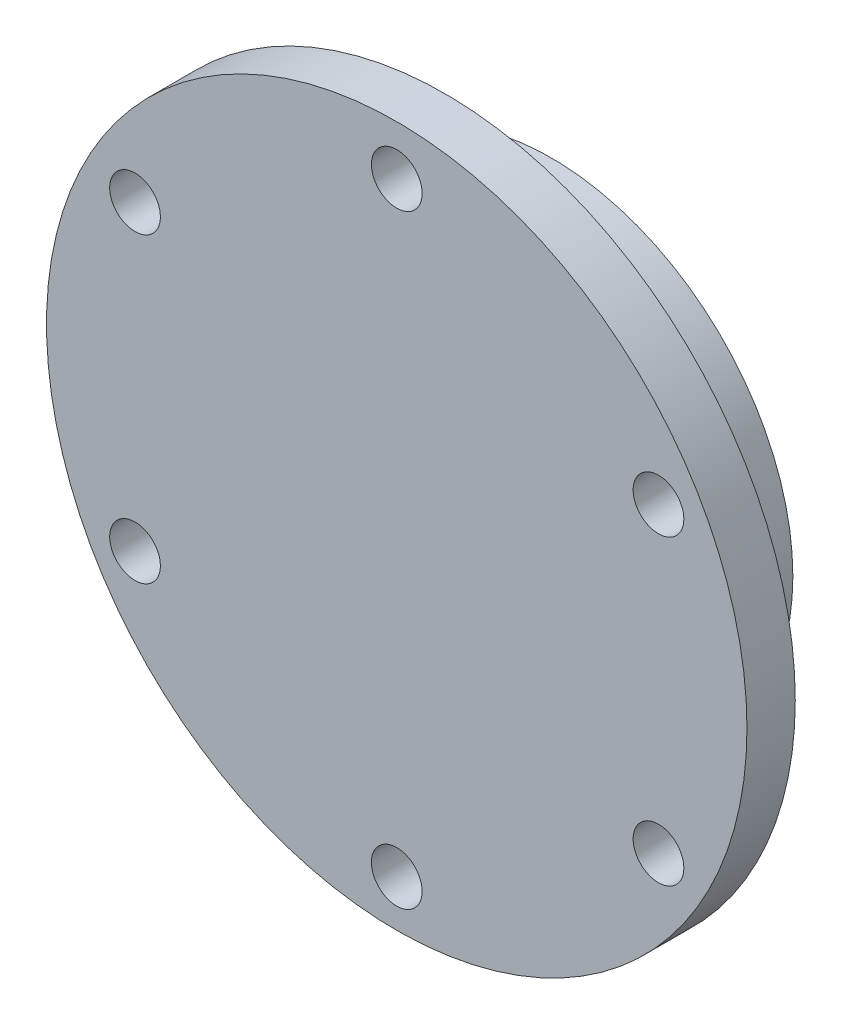
ISO-10303-21;
HEADER;
FILE_DESCRIPTION(('STEP AP214'),'2;1');
FILE_NAME('part.step','',(''),(''),'','','');
FILE_SCHEMA(('AUTOMOTIVE_DESIGN { 1 0 10303 214 1 1 1 1 }'));
ENDSEC;
DATA;
#1=APPLICATION_CONTEXT('core data for automotive mechanical design processes');
#2=APPLICATION_PROTOCOL_DEFINITION('international standard','automotive_design',2000,#1);
#3=PRODUCT_CONTEXT('',#1,'mechanical');
#4=PRODUCT('Part','Part','',(#3));
#5=PRODUCT_RELATED_PRODUCT_CATEGORY('part','',(#4));
#6=PRODUCT_DEFINITION_FORMATION('','',#4);
#7=PRODUCT_DEFINITION_CONTEXT('part definition',#1,'design');
#8=PRODUCT_DEFINITION('design','',#6,#7);
#9=PRODUCT_DEFINITION_SHAPE('','',#8);
#10=(LENGTH_UNIT() NAMED_UNIT(*) SI_UNIT(.MILLI.,.METRE.));
#11=(NAMED_UNIT(*) PLANE_ANGLE_UNIT() SI_UNIT($,.RADIAN.));
#12=(NAMED_UNIT(*) SI_UNIT($,.STERADIAN.) SOLID_ANGLE_UNIT());
#13=UNCERTAINTY_MEASURE_WITH_UNIT(LENGTH_MEASURE(1.E-05),#10,'distance_accuracy_value','');
#14=(GEOMETRIC_REPRESENTATION_CONTEXT(3) GLOBAL_UNCERTAINTY_ASSIGNED_CONTEXT((#13)) GLOBAL_UNIT_ASSIGNED_CONTEXT((#10,
#11,#12)) REPRESENTATION_CONTEXT('',''));
#15=CARTESIAN_POINT('',(0.,0.,0.));
#16=DIRECTION('',(0.,0.,1.));
#17=DIRECTION('',(1.,0.,0.));
#18=AXIS2_PLACEMENT_3D('',#15,#16,#17);
#19=CARTESIAN_POINT('',(0.,0.,10.));
#20=DIRECTION('',(0.,0.,-1.));
#21=DIRECTION('',(-1.,0.,0.));
#22=AXIS2_PLACEMENT_3D('',#19,#20,#21);
#23=CYLINDRICAL_SURFACE('',#22,72.5);
#24=CARTESIAN_POINT('',(0.,0.,10.));
#25=DIRECTION('',(0.,0.,1.));
#26=DIRECTION('',(1.,0.,0.));
#27=AXIS2_PLACEMENT_3D('',#24,#25,#26);
#28=CIRCLE('',#27,72.5);
#29=CARTESIAN_POINT('',(72.5,0.,10.));
#30=VERTEX_POINT('',#29);
#31=EDGE_CURVE('E37',#30,#30,#28,.T.);
#32=ORIENTED_EDGE('',*,*,#31,.F.);
#33=EDGE_LOOP('',(#32));
#34=FACE_BOUND('',#33,.T.);
#35=CARTESIAN_POINT('',(0.,0.,0.));
#36=DIRECTION('',(0.,0.,1.));
#37=DIRECTION('',(1.,0.,0.));
#38=AXIS2_PLACEMENT_3D('',#35,#36,#37);
#39=CIRCLE('',#38,72.5);
#40=CARTESIAN_POINT('',(72.5,0.,0.));
#41=VERTEX_POINT('',#40);
#42=EDGE_CURVE('E33',#41,#41,#39,.T.);
#43=ORIENTED_EDGE('',*,*,#42,.T.);
#44=EDGE_LOOP('',(#43));
#45=FACE_BOUND('',#44,.T.);
#46=ADVANCED_FACE('F30',(#34,#45),#23,.T.);
#47=CARTESIAN_POINT('',(0.,0.,10.));
#48=DIRECTION('',(0.,0.,1.));
#49=DIRECTION('',(1.,0.,0.));
#50=AXIS2_PLACEMENT_3D('',#47,#48,#49);
#51=PLANE('',#50);
#52=CARTESIAN_POINT('',(-54.180005377678,30.9527824078323,10.));
#53=DIRECTION('',(0.,0.,1.));
#54=DIRECTION('',(1.,0.,0.));
#55=AXIS2_PLACEMENT_3D('',#52,#53,#54);
#56=CIRCLE('',#55,5.24999999999999);
#57=CARTESIAN_POINT('',(-48.9300053776781,30.9527824078323,10.));
#58=VERTEX_POINT('',#57);
#59=EDGE_CURVE('E48',#58,#58,#56,.T.);
#60=ORIENTED_EDGE('',*,*,#59,.F.);
#61=EDGE_LOOP('',(#60));
#62=FACE_BOUND('',#61,.T.);
#63=CARTESIAN_POINT('',(-54.1800053776787,-31.6088989711638,10.));
#64=DIRECTION('',(0.,0.,1.));
#65=DIRECTION('',(1.,0.,0.));
#66=AXIS2_PLACEMENT_3D('',#63,#64,#65);
#67=CIRCLE('',#66,5.24999999999999);
#68=CARTESIAN_POINT('',(-48.9300053776787,-31.6088989711638,10.));
#69=VERTEX_POINT('',#68);
#70=EDGE_CURVE('E54',#69,#69,#67,.T.);
#71=ORIENTED_EDGE('',*,*,#70,.F.);
#72=EDGE_LOOP('',(#71));
#73=FACE_BOUND('',#72,.T.);
#74=CARTESIAN_POINT('',(0.,-62.8897396606623,10.));
#75=DIRECTION('',(0.,0.,1.));
#76=DIRECTION('',(1.,0.,0.));
#77=AXIS2_PLACEMENT_3D('',#74,#75,#76);
#78=CIRCLE('',#77,5.24999999999999);
#79=CARTESIAN_POINT('',(5.24999999999999,-62.8897396606623,10.));
#80=VERTEX_POINT('',#79);
#81=EDGE_CURVE('E60',#80,#80,#78,.T.);
#82=ORIENTED_EDGE('',*,*,#81,.F.);
#83=EDGE_LOOP('',(#82));
#84=FACE_BOUND('',#83,.T.);
#85=CARTESIAN_POINT('',(54.1800053776783,-31.6088989711646,10.));
#86=DIRECTION('',(0.,0.,1.));
#87=DIRECTION('',(1.,0.,0.));
#88=AXIS2_PLACEMENT_3D('',#85,#86,#87);
#89=CIRCLE('',#88,5.24999999999999);
#90=CARTESIAN_POINT('',(59.4300053776783,-31.6088989711646,10.));
#91=VERTEX_POINT('',#90);
#92=EDGE_CURVE('E66',#91,#91,#89,.T.);
#93=ORIENTED_EDGE('',*,*,#92,.F.);
#94=EDGE_LOOP('',(#93));
#95=FACE_BOUND('',#94,.T.);
#96=CARTESIAN_POINT('',(54.1800053776785,30.9527824078316,10.));
#97=DIRECTION('',(0.,0.,1.));
#98=DIRECTION('',(1.,0.,0.));
#99=AXIS2_PLACEMENT_3D('',#96,#97,#98);
#100=CIRCLE('',#99,5.24999999999999);
#101=CARTESIAN_POINT('',(59.4300053776785,30.9527824078316,10.));
#102=VERTEX_POINT('',#101);
#103=EDGE_CURVE('E72',#102,#102,#100,.T.);
#104=ORIENTED_EDGE('',*,*,#103,.F.);
#105=EDGE_LOOP('',(#104));
#106=FACE_BOUND('',#105,.T.);
#107=CARTESIAN_POINT('',(0.,62.2336230973297,10.));
#108=DIRECTION('',(0.,0.,1.));
#109=DIRECTION('',(1.,0.,0.));
#110=AXIS2_PLACEMENT_3D('',#107,#108,#109);
#111=CIRCLE('',#110,5.24999999999999);
#112=CARTESIAN_POINT('',(5.24999999999999,62.2336230973297,10.));
#113=VERTEX_POINT('',#112);
#114=EDGE_CURVE('E78',#113,#113,#111,.T.);
#115=ORIENTED_EDGE('',*,*,#114,.F.);
#116=EDGE_LOOP('',(#115));
#117=FACE_BOUND('',#116,.T.);
#118=ORIENTED_EDGE('',*,*,#31,.T.);
#119=EDGE_LOOP('',(#118));
#120=FACE_BOUND('',#119,.T.);
#121=ADVANCED_FACE('F89',(#62,#73,#84,#95,#106,#117,#120),#51,.T.);
#122=CARTESIAN_POINT('',(0.,0.,0.));
#123=DIRECTION('',(0.,0.,1.));
#124=DIRECTION('',(1.,0.,0.));
#125=AXIS2_PLACEMENT_3D('',#122,#123,#124);
#126=PLANE('',#125);
#127=CARTESIAN_POINT('',(0.,0.,0.));
#128=DIRECTION('',(0.,0.,-1.));
#129=DIRECTION('',(-1.,0.,0.));
#130=AXIS2_PLACEMENT_3D('',#127,#128,#129);
#131=CIRCLE('',#130,50.);
#132=CARTESIAN_POINT('',(-50.,0.,0.));
#133=VERTEX_POINT('',#132);
#134=EDGE_CURVE('E10',#133,#133,#131,.T.);
#135=ORIENTED_EDGE('',*,*,#134,.F.);
#136=EDGE_LOOP('',(#135));
#137=FACE_BOUND('',#136,.T.);
#138=CARTESIAN_POINT('',(-54.180005377678,30.9527824078323,0.));
#139=DIRECTION('',(0.,0.,-1.));
#140=DIRECTION('',(-1.,0.,0.));
#141=AXIS2_PLACEMENT_3D('',#138,#139,#140);
#142=CIRCLE('',#141,5.25);
#143=CARTESIAN_POINT('',(-59.430005377678,30.9527824078323,0.));
#144=VERTEX_POINT('',#143);
#145=EDGE_CURVE('E45',#144,#144,#142,.T.);
#146=ORIENTED_EDGE('',*,*,#145,.F.);
#147=EDGE_LOOP('',(#146));
#148=FACE_BOUND('',#147,.T.);
#149=CARTESIAN_POINT('',(-54.1800053776787,-31.6088989711638,0.));
#150=DIRECTION('',(0.,0.,-1.));
#151=DIRECTION('',(-1.,0.,0.));
#152=AXIS2_PLACEMENT_3D('',#149,#150,#151);
#153=CIRCLE('',#152,5.25);
#154=CARTESIAN_POINT('',(-59.4300053776787,-31.6088989711638,0.));
#155=VERTEX_POINT('',#154);
#156=EDGE_CURVE('E51',#155,#155,#153,.T.);
#157=ORIENTED_EDGE('',*,*,#156,.F.);
#158=EDGE_LOOP('',(#157));
#159=FACE_BOUND('',#158,.T.);
#160=CARTESIAN_POINT('',(0.,-62.8897396606623,0.));
#161=DIRECTION('',(0.,0.,-1.));
#162=DIRECTION('',(-1.,0.,0.));
#163=AXIS2_PLACEMENT_3D('',#160,#161,#162);
#164=CIRCLE('',#163,5.25);
#165=CARTESIAN_POINT('',(-5.25,-62.8897396606623,0.));
#166=VERTEX_POINT('',#165);
#167=EDGE_CURVE('E57',#166,#166,#164,.T.);
#168=ORIENTED_EDGE('',*,*,#167,.F.);
#169=EDGE_LOOP('',(#168));
#170=FACE_BOUND('',#169,.T.);
#171=CARTESIAN_POINT('',(54.1800053776783,-31.6088989711646,0.));
#172=DIRECTION('',(0.,0.,-1.));
#173=DIRECTION('',(-1.,0.,0.));
#174=AXIS2_PLACEMENT_3D('',#171,#172,#173);
#175=CIRCLE('',#174,5.25);
#176=CARTESIAN_POINT('',(48.9300053776783,-31.6088989711646,0.));
#177=VERTEX_POINT('',#176);
#178=EDGE_CURVE('E63',#177,#177,#175,.T.);
#179=ORIENTED_EDGE('',*,*,#178,.F.);
#180=EDGE_LOOP('',(#179));
#181=FACE_BOUND('',#180,.T.);
#182=CARTESIAN_POINT('',(54.1800053776785,30.9527824078316,0.));
#183=DIRECTION('',(0.,0.,-1.));
#184=DIRECTION('',(-1.,0.,0.));
#185=AXIS2_PLACEMENT_3D('',#182,#183,#184);
#186=CIRCLE('',#185,5.25);
#187=CARTESIAN_POINT('',(48.9300053776785,30.9527824078316,0.));
#188=VERTEX_POINT('',#187);
#189=EDGE_CURVE('E69',#188,#188,#186,.T.);
#190=ORIENTED_EDGE('',*,*,#189,.F.);
#191=EDGE_LOOP('',(#190));
#192=FACE_BOUND('',#191,.T.);
#193=CARTESIAN_POINT('',(0.,62.2336230973297,0.));
#194=DIRECTION('',(0.,0.,-1.));
#195=DIRECTION('',(-1.,0.,0.));
#196=AXIS2_PLACEMENT_3D('',#193,#194,#195);
#197=CIRCLE('',#196,5.25);
#198=CARTESIAN_POINT('',(-5.25,62.2336230973297,0.));
#199=VERTEX_POINT('',#198);
#200=EDGE_CURVE('E75',#199,#199,#197,.T.);
#201=ORIENTED_EDGE('',*,*,#200,.F.);
#202=EDGE_LOOP('',(#201));
#203=FACE_BOUND('',#202,.T.);
#204=ORIENTED_EDGE('',*,*,#42,.F.);
#205=EDGE_LOOP('',(#204));
#206=FACE_BOUND('',#205,.T.);
#207=ADVANCED_FACE('F86',(#137,#148,#159,#170,#181,#192,#203,#206),#126,.F.);
#208=CARTESIAN_POINT('',(0.,62.2336230973297,0.));
#209=DIRECTION('',(0.,0.,-1.));
#210=DIRECTION('',(-1.,0.,0.));
#211=AXIS2_PLACEMENT_3D('',#208,#209,#210);
#212=CYLINDRICAL_SURFACE('',#211,5.24999999999999);
#213=ORIENTED_EDGE('',*,*,#114,.T.);
#214=EDGE_LOOP('',(#213));
#215=FACE_BOUND('',#214,.T.);
#216=ORIENTED_EDGE('',*,*,#200,.T.);
#217=EDGE_LOOP('',(#216));
#218=FACE_BOUND('',#217,.T.);
#219=ADVANCED_FACE('F88',(#215,#218),#212,.F.);
#220=CARTESIAN_POINT('',(54.1800053776785,30.9527824078316,0.));
#221=DIRECTION('',(0.,0.,-1.));
#222=DIRECTION('',(-1.,0.,0.));
#223=AXIS2_PLACEMENT_3D('',#220,#221,#222);
#224=CYLINDRICAL_SURFACE('',#223,5.24999999999999);
#225=ORIENTED_EDGE('',*,*,#103,.T.);
#226=EDGE_LOOP('',(#225));
#227=FACE_BOUND('',#226,.T.);
#228=ORIENTED_EDGE('',*,*,#189,.T.);
#229=EDGE_LOOP('',(#228));
#230=FACE_BOUND('',#229,.T.);
#231=ADVANCED_FACE('F95',(#227,#230),#224,.F.);
#232=CARTESIAN_POINT('',(54.1800053776783,-31.6088989711646,0.));
#233=DIRECTION('',(0.,0.,-1.));
#234=DIRECTION('',(-1.,0.,0.));
#235=AXIS2_PLACEMENT_3D('',#232,#233,#234);
#236=CYLINDRICAL_SURFACE('',#235,5.24999999999999);
#237=ORIENTED_EDGE('',*,*,#92,.T.);
#238=EDGE_LOOP('',(#237));
#239=FACE_BOUND('',#238,.T.);
#240=ORIENTED_EDGE('',*,*,#178,.T.);
#241=EDGE_LOOP('',(#240));
#242=FACE_BOUND('',#241,.T.);
#243=ADVANCED_FACE('F123',(#239,#242),#236,.F.);
#244=CARTESIAN_POINT('',(0.,-62.8897396606623,0.));
#245=DIRECTION('',(0.,0.,-1.));
#246=DIRECTION('',(-1.,0.,0.));
#247=AXIS2_PLACEMENT_3D('',#244,#245,#246);
#248=CYLINDRICAL_SURFACE('',#247,5.24999999999999);
#249=ORIENTED_EDGE('',*,*,#81,.T.);
#250=EDGE_LOOP('',(#249));
#251=FACE_BOUND('',#250,.T.);
#252=ORIENTED_EDGE('',*,*,#167,.T.);
#253=EDGE_LOOP('',(#252));
#254=FACE_BOUND('',#253,.T.);
#255=ADVANCED_FACE('F133',(#251,#254),#248,.F.);
#256=CARTESIAN_POINT('',(-54.1800053776787,-31.6088989711638,0.));
#257=DIRECTION('',(0.,0.,-1.));
#258=DIRECTION('',(-1.,0.,0.));
#259=AXIS2_PLACEMENT_3D('',#256,#257,#258);
#260=CYLINDRICAL_SURFACE('',#259,5.24999999999999);
#261=ORIENTED_EDGE('',*,*,#70,.T.);
#262=EDGE_LOOP('',(#261));
#263=FACE_BOUND('',#262,.T.);
#264=ORIENTED_EDGE('',*,*,#156,.T.);
#265=EDGE_LOOP('',(#264));
#266=FACE_BOUND('',#265,.T.);
#267=ADVANCED_FACE('F143',(#263,#266),#260,.F.);
#268=CARTESIAN_POINT('',(-54.180005377678,30.9527824078323,0.));
#269=DIRECTION('',(0.,0.,-1.));
#270=DIRECTION('',(-1.,0.,0.));
#271=AXIS2_PLACEMENT_3D('',#268,#269,#270);
#272=CYLINDRICAL_SURFACE('',#271,5.24999999999999);
#273=ORIENTED_EDGE('',*,*,#59,.T.);
#274=EDGE_LOOP('',(#273));
#275=FACE_BOUND('',#274,.T.);
#276=ORIENTED_EDGE('',*,*,#145,.T.);
#277=EDGE_LOOP('',(#276));
#278=FACE_BOUND('',#277,.T.);
#279=ADVANCED_FACE('F153',(#275,#278),#272,.F.);
#280=CARTESIAN_POINT('',(0.,0.,-22.));
#281=DIRECTION('',(0.,0.,1.));
#282=DIRECTION('',(1.,0.,0.));
#283=AXIS2_PLACEMENT_3D('',#280,#281,#282);
#284=CYLINDRICAL_SURFACE('',#283,50.);
#285=CARTESIAN_POINT('',(0.,0.,-22.));
#286=DIRECTION('',(0.,0.,-1.));
#287=DIRECTION('',(-1.,0.,0.));
#288=AXIS2_PLACEMENT_3D('',#285,#286,#287);
#289=CIRCLE('',#288,50.);
#290=CARTESIAN_POINT('',(-50.,0.,-22.));
#291=VERTEX_POINT('',#290);
#292=EDGE_CURVE('E44',#291,#291,#289,.T.);
#293=ORIENTED_EDGE('',*,*,#292,.F.);
#294=EDGE_LOOP('',(#293));
#295=FACE_BOUND('',#294,.T.);
#296=ORIENTED_EDGE('',*,*,#134,.T.);
#297=EDGE_LOOP('',(#296));
#298=FACE_BOUND('',#297,.T.);
#299=ADVANCED_FACE('F162',(#295,#298),#284,.T.);
#300=CARTESIAN_POINT('',(0.,0.,-22.));
#301=DIRECTION('',(0.,0.,-1.));
#302=DIRECTION('',(-1.,0.,0.));
#303=AXIS2_PLACEMENT_3D('',#300,#301,#302);
#304=PLANE('',#303);
#305=ORIENTED_EDGE('',*,*,#292,.T.);
#306=EDGE_LOOP('',(#305));
#307=FACE_BOUND('',#306,.T.);
#308=ADVANCED_FACE('F176',(#307),#304,.T.);
#309=CLOSED_SHELL('',(#46,#121,#207,#219,#231,#243,#255,#267,#279,#299,#308));
#310=MANIFOLD_SOLID_BREP('B2',#309);
#311=ADVANCED_BREP_SHAPE_REPRESENTATION('',(#18,#310),#14);
#312=SHAPE_DEFINITION_REPRESENTATION(#9,#311);
ENDSEC;
END-ISO-10303-21;
